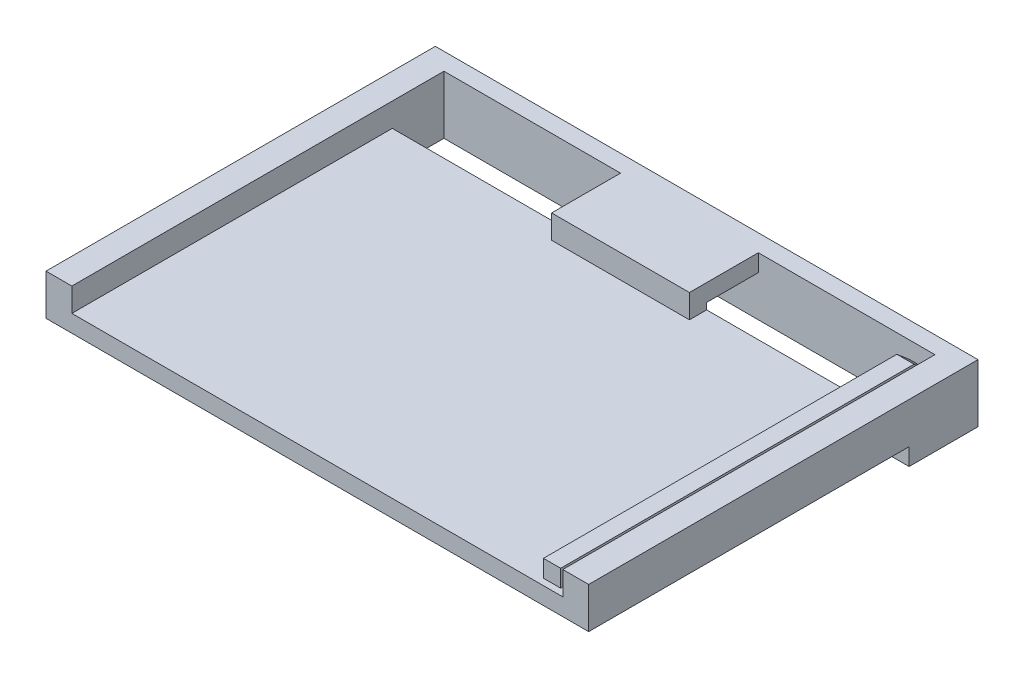
ISO-10303-21;
HEADER;
FILE_DESCRIPTION(('STEP AP214'),'2;1');
FILE_NAME('part.step','',(''),(''),'','','');
FILE_SCHEMA(('AUTOMOTIVE_DESIGN { 1 0 10303 214 1 1 1 1 }'));
ENDSEC;
DATA;
#1=APPLICATION_CONTEXT('core data for automotive mechanical design processes');
#2=APPLICATION_PROTOCOL_DEFINITION('international standard','automotive_design',2000,#1);
#3=PRODUCT_CONTEXT('',#1,'mechanical');
#4=PRODUCT('Part','Part','',(#3));
#5=PRODUCT_RELATED_PRODUCT_CATEGORY('part','',(#4));
#6=PRODUCT_DEFINITION_FORMATION('','',#4);
#7=PRODUCT_DEFINITION_CONTEXT('part definition',#1,'design');
#8=PRODUCT_DEFINITION('design','',#6,#7);
#9=PRODUCT_DEFINITION_SHAPE('','',#8);
#10=(LENGTH_UNIT() NAMED_UNIT(*) SI_UNIT(.MILLI.,.METRE.));
#11=(NAMED_UNIT(*) PLANE_ANGLE_UNIT() SI_UNIT($,.RADIAN.));
#12=(NAMED_UNIT(*) SI_UNIT($,.STERADIAN.) SOLID_ANGLE_UNIT());
#13=UNCERTAINTY_MEASURE_WITH_UNIT(LENGTH_MEASURE(1.E-05),#10,'distance_accuracy_value','');
#14=(GEOMETRIC_REPRESENTATION_CONTEXT(3) GLOBAL_UNCERTAINTY_ASSIGNED_CONTEXT((#13)) GLOBAL_UNIT_ASSIGNED_CONTEXT((#10,
#11,#12)) REPRESENTATION_CONTEXT('',''));
#15=CARTESIAN_POINT('',(0.,0.,0.));
#16=DIRECTION('',(0.,0.,1.));
#17=DIRECTION('',(1.,0.,0.));
#18=AXIS2_PLACEMENT_3D('',#15,#16,#17);
#19=CARTESIAN_POINT('',(31.5,2.,-14.6));
#20=DIRECTION('',(0.,0.,-1.));
#21=DIRECTION('',(-1.,0.,0.));
#22=AXIS2_PLACEMENT_3D('',#19,#20,#21);
#23=PLANE('',#22);
#24=DIRECTION('',(1.,0.,0.));
#25=VECTOR('',#24,1.);
#26=CARTESIAN_POINT('',(31.5,0.,-14.6));
#27=LINE('',#26,#25);
#28=CARTESIAN_POINT('',(-31.5,0.,-14.6));
#29=VERTEX_POINT('',#28);
#30=CARTESIAN_POINT('',(-28.5,0.,-14.6));
#31=VERTEX_POINT('',#30);
#32=EDGE_CURVE('E309',#29,#31,#27,.T.);
#33=ORIENTED_EDGE('',*,*,#32,.T.);
#34=DIRECTION('',(0.,-1.,0.));
#35=VECTOR('',#34,1.);
#36=CARTESIAN_POINT('',(-28.5,6.75,-14.6));
#37=LINE('',#36,#35);
#38=CARTESIAN_POINT('',(-28.5,2.,-14.6));
#39=VERTEX_POINT('',#38);
#40=EDGE_CURVE('E247',#39,#31,#37,.T.);
#41=ORIENTED_EDGE('',*,*,#40,.F.);
#42=DIRECTION('',(1.,0.,0.));
#43=VECTOR('',#42,1.);
#44=CARTESIAN_POINT('',(31.5,2.,-14.6));
#45=LINE('',#44,#43);
#46=CARTESIAN_POINT('',(-31.5,2.,-14.6));
#47=VERTEX_POINT('',#46);
#48=EDGE_CURVE('E314',#47,#39,#45,.T.);
#49=ORIENTED_EDGE('',*,*,#48,.F.);
#50=DIRECTION('',(0.,-1.,0.));
#51=VECTOR('',#50,1.);
#52=CARTESIAN_POINT('',(-31.5,2.,-14.6));
#53=LINE('',#52,#51);
#54=EDGE_CURVE('E316',#47,#29,#53,.T.);
#55=ORIENTED_EDGE('',*,*,#54,.T.);
#56=EDGE_LOOP('',(#33,#41,#49,#55));
#57=FACE_BOUND('',#56,.T.);
#58=ADVANCED_FACE('F47',(#57),#23,.F.);
#59=CARTESIAN_POINT('',(-31.5,6.75,22.6));
#60=DIRECTION('',(0.,0.,-1.));
#61=DIRECTION('',(-1.,0.,0.));
#62=AXIS2_PLACEMENT_3D('',#59,#60,#61);
#63=PLANE('',#62);
#64=DIRECTION('',(1.,0.,0.));
#65=VECTOR('',#64,1.);
#66=CARTESIAN_POINT('',(-31.5,6.75,22.6));
#67=LINE('',#66,#65);
#68=CARTESIAN_POINT('',(28.5,6.75,22.6));
#69=VERTEX_POINT('',#68);
#70=CARTESIAN_POINT('',(31.5,6.75,22.6));
#71=VERTEX_POINT('',#70);
#72=EDGE_CURVE('E327',#69,#71,#67,.T.);
#73=ORIENTED_EDGE('',*,*,#72,.F.);
#74=DIRECTION('',(0.,1.,0.));
#75=VECTOR('',#74,1.);
#76=CARTESIAN_POINT('',(28.5,-69.5209060345295,22.6));
#77=LINE('',#76,#75);
#78=CARTESIAN_POINT('',(28.5,3.99999999999998,22.6));
#79=VERTEX_POINT('',#78);
#80=EDGE_CURVE('E274',#79,#69,#77,.T.);
#81=ORIENTED_EDGE('',*,*,#80,.F.);
#82=DIRECTION('',(1.,0.,0.));
#83=VECTOR('',#82,1.);
#84=CARTESIAN_POINT('',(-28.5,4.,22.6));
#85=LINE('',#84,#83);
#86=CARTESIAN_POINT('',(-28.5,4.,22.6));
#87=VERTEX_POINT('',#86);
#88=EDGE_CURVE('E256',#87,#79,#85,.T.);
#89=ORIENTED_EDGE('',*,*,#88,.F.);
#90=DIRECTION('',(0.,1.,0.));
#91=VECTOR('',#90,1.);
#92=CARTESIAN_POINT('',(-28.5,-69.5209060345295,22.6));
#93=LINE('',#92,#91);
#94=CARTESIAN_POINT('',(-28.5,6.75,22.6));
#95=VERTEX_POINT('',#94);
#96=EDGE_CURVE('E277',#87,#95,#93,.T.);
#97=ORIENTED_EDGE('',*,*,#96,.T.);
#98=CARTESIAN_POINT('',(-31.5,6.75,22.6));
#99=VERTEX_POINT('',#98);
#100=EDGE_CURVE('E329',#99,#95,#67,.T.);
#101=ORIENTED_EDGE('',*,*,#100,.F.);
#102=DIRECTION('',(0.,-1.,0.));
#103=VECTOR('',#102,1.);
#104=CARTESIAN_POINT('',(-31.5,6.75,22.6));
#105=LINE('',#104,#103);
#106=CARTESIAN_POINT('',(-31.5,2.,22.6));
#107=VERTEX_POINT('',#106);
#108=EDGE_CURVE('E55',#99,#107,#105,.T.);
#109=ORIENTED_EDGE('',*,*,#108,.T.);
#110=DIRECTION('',(-1.,0.,0.));
#111=VECTOR('',#110,1.);
#112=CARTESIAN_POINT('',(31.5,2.,22.6));
#113=LINE('',#112,#111);
#114=CARTESIAN_POINT('',(31.5,2.,22.6));
#115=VERTEX_POINT('',#114);
#116=EDGE_CURVE('E308',#115,#107,#113,.T.);
#117=ORIENTED_EDGE('',*,*,#116,.F.);
#118=DIRECTION('',(0.,-1.,0.));
#119=VECTOR('',#118,1.);
#120=CARTESIAN_POINT('',(31.5,6.75,22.6));
#121=LINE('',#120,#119);
#122=EDGE_CURVE('E347',#71,#115,#121,.T.);
#123=ORIENTED_EDGE('',*,*,#122,.F.);
#124=EDGE_LOOP('',(#73,#81,#89,#97,#101,#109,#117,#123));
#125=FACE_BOUND('',#124,.T.);
#126=ADVANCED_FACE('F354',(#125),#63,.F.);
#127=CARTESIAN_POINT('',(-31.5,6.75,-22.6));
#128=DIRECTION('',(1.,0.,0.));
#129=DIRECTION('',(0.,0.,-1.));
#130=AXIS2_PLACEMENT_3D('',#127,#128,#129);
#131=PLANE('',#130);
#132=DIRECTION('',(0.,0.,1.));
#133=VECTOR('',#132,1.);
#134=CARTESIAN_POINT('',(-31.5,0.,-22.6));
#135=LINE('',#134,#133);
#136=CARTESIAN_POINT('',(-31.5,0.,-22.6));
#137=VERTEX_POINT('',#136);
#138=EDGE_CURVE('E322',#137,#29,#135,.T.);
#139=ORIENTED_EDGE('',*,*,#138,.T.);
#140=ORIENTED_EDGE('',*,*,#54,.F.);
#141=DIRECTION('',(0.,0.,-1.));
#142=VECTOR('',#141,1.);
#143=CARTESIAN_POINT('',(-31.5,2.,-14.6));
#144=LINE('',#143,#142);
#145=EDGE_CURVE('E311',#107,#47,#144,.T.);
#146=ORIENTED_EDGE('',*,*,#145,.F.);
#147=ORIENTED_EDGE('',*,*,#108,.F.);
#148=DIRECTION('',(0.,0.,1.));
#149=VECTOR('',#148,1.);
#150=CARTESIAN_POINT('',(-31.5,6.75,-22.6));
#151=LINE('',#150,#149);
#152=CARTESIAN_POINT('',(-31.5,6.75,-22.6));
#153=VERTEX_POINT('',#152);
#154=EDGE_CURVE('E324',#153,#99,#151,.T.);
#155=ORIENTED_EDGE('',*,*,#154,.F.);
#156=DIRECTION('',(0.,-1.,0.));
#157=VECTOR('',#156,1.);
#158=CARTESIAN_POINT('',(-31.5,6.75,-22.6));
#159=LINE('',#158,#157);
#160=EDGE_CURVE('E336',#153,#137,#159,.T.);
#161=ORIENTED_EDGE('',*,*,#160,.T.);
#162=EDGE_LOOP('',(#139,#140,#146,#147,#155,#161));
#163=FACE_BOUND('',#162,.T.);
#164=ADVANCED_FACE('F49',(#163),#131,.F.);
#165=CARTESIAN_POINT('',(31.5,6.75,-22.6));
#166=DIRECTION('',(-1.,0.,0.));
#167=DIRECTION('',(0.,0.,1.));
#168=AXIS2_PLACEMENT_3D('',#165,#166,#167);
#169=PLANE('',#168);
#170=DIRECTION('',(0.,0.,1.));
#171=VECTOR('',#170,1.);
#172=CARTESIAN_POINT('',(31.5,2.,-14.6));
#173=LINE('',#172,#171);
#174=CARTESIAN_POINT('',(31.5,2.,-14.6));
#175=VERTEX_POINT('',#174);
#176=EDGE_CURVE('E306',#175,#115,#173,.T.);
#177=ORIENTED_EDGE('',*,*,#176,.F.);
#178=DIRECTION('',(0.,-1.,0.));
#179=VECTOR('',#178,1.);
#180=CARTESIAN_POINT('',(31.5,2.,-14.6));
#181=LINE('',#180,#179);
#182=CARTESIAN_POINT('',(31.5,0.,-14.6));
#183=VERTEX_POINT('',#182);
#184=EDGE_CURVE('E319',#175,#183,#181,.T.);
#185=ORIENTED_EDGE('',*,*,#184,.T.);
#186=DIRECTION('',(0.,0.,-1.));
#187=VECTOR('',#186,1.);
#188=CARTESIAN_POINT('',(31.5,0.,-22.6));
#189=LINE('',#188,#187);
#190=CARTESIAN_POINT('',(31.5,0.,-22.6));
#191=VERTEX_POINT('',#190);
#192=EDGE_CURVE('E339',#183,#191,#189,.T.);
#193=ORIENTED_EDGE('',*,*,#192,.T.);
#194=DIRECTION('',(0.,-1.,0.));
#195=VECTOR('',#194,1.);
#196=CARTESIAN_POINT('',(31.5,6.75,-22.6));
#197=LINE('',#196,#195);
#198=CARTESIAN_POINT('',(31.5,6.75,-22.6));
#199=VERTEX_POINT('',#198);
#200=EDGE_CURVE('E344',#199,#191,#197,.T.);
#201=ORIENTED_EDGE('',*,*,#200,.F.);
#202=DIRECTION('',(0.,0.,-1.));
#203=VECTOR('',#202,1.);
#204=CARTESIAN_POINT('',(31.5,6.75,-22.6));
#205=LINE('',#204,#203);
#206=EDGE_CURVE('E332',#71,#199,#205,.T.);
#207=ORIENTED_EDGE('',*,*,#206,.F.);
#208=ORIENTED_EDGE('',*,*,#122,.T.);
#209=EDGE_LOOP('',(#177,#185,#193,#201,#207,#208));
#210=FACE_BOUND('',#209,.T.);
#211=ADVANCED_FACE('F432',(#210),#169,.F.);
#212=CARTESIAN_POINT('',(-31.5,6.75,-22.6));
#213=DIRECTION('',(0.,0.,1.));
#214=DIRECTION('',(1.,0.,0.));
#215=AXIS2_PLACEMENT_3D('',#212,#213,#214);
#216=PLANE('',#215);
#217=DIRECTION('',(-1.,0.,0.));
#218=VECTOR('',#217,1.);
#219=CARTESIAN_POINT('',(-31.5,0.,-22.6));
#220=LINE('',#219,#218);
#221=EDGE_CURVE('E328',#191,#137,#220,.T.);
#222=ORIENTED_EDGE('',*,*,#221,.T.);
#223=ORIENTED_EDGE('',*,*,#160,.F.);
#224=DIRECTION('',(-1.,0.,0.));
#225=VECTOR('',#224,1.);
#226=CARTESIAN_POINT('',(-31.5,6.75,-22.6));
#227=LINE('',#226,#225);
#228=EDGE_CURVE('E334',#199,#153,#227,.T.);
#229=ORIENTED_EDGE('',*,*,#228,.F.);
#230=ORIENTED_EDGE('',*,*,#200,.T.);
#231=EDGE_LOOP('',(#222,#223,#229,#230));
#232=FACE_BOUND('',#231,.T.);
#233=ADVANCED_FACE('F436',(#232),#216,.F.);
#234=CARTESIAN_POINT('',(0.,6.75,0.));
#235=DIRECTION('',(0.,1.,0.));
#236=DIRECTION('',(0.,0.,1.));
#237=AXIS2_PLACEMENT_3D('',#234,#235,#236);
#238=PLANE('',#237);
#239=DIRECTION('',(0.,0.,-1.));
#240=VECTOR('',#239,1.);
#241=CARTESIAN_POINT('',(28.5,6.75,-20.6));
#242=LINE('',#241,#240);
#243=CARTESIAN_POINT('',(28.5,6.75,-20.6));
#244=VERTEX_POINT('',#243);
#245=EDGE_CURVE('E268',#69,#244,#242,.T.);
#246=ORIENTED_EDGE('',*,*,#245,.F.);
#247=ORIENTED_EDGE('',*,*,#72,.T.);
#248=ORIENTED_EDGE('',*,*,#206,.T.);
#249=ORIENTED_EDGE('',*,*,#228,.T.);
#250=ORIENTED_EDGE('',*,*,#154,.T.);
#251=ORIENTED_EDGE('',*,*,#100,.T.);
#252=DIRECTION('',(0.,0.,1.));
#253=VECTOR('',#252,1.);
#254=CARTESIAN_POINT('',(-28.5,6.75,-20.6));
#255=LINE('',#254,#253);
#256=CARTESIAN_POINT('',(-28.5,6.75,-20.6));
#257=VERTEX_POINT('',#256);
#258=EDGE_CURVE('E253',#257,#95,#255,.T.);
#259=ORIENTED_EDGE('',*,*,#258,.F.);
#260=DIRECTION('',(-1.,0.,0.));
#261=VECTOR('',#260,1.);
#262=CARTESIAN_POINT('',(-28.5,6.75,-20.6));
#263=LINE('',#262,#261);
#264=CARTESIAN_POINT('',(-8.,6.75,-20.6));
#265=VERTEX_POINT('',#264);
#266=EDGE_CURVE('E254',#265,#257,#263,.T.);
#267=ORIENTED_EDGE('',*,*,#266,.F.);
#268=DIRECTION('',(0.,0.,-1.));
#269=VECTOR('',#268,1.);
#270=CARTESIAN_POINT('',(-8.,6.75,-20.6));
#271=LINE('',#270,#269);
#272=CARTESIAN_POINT('',(-8.,6.75,-12.6));
#273=VERTEX_POINT('',#272);
#274=EDGE_CURVE('E257',#273,#265,#271,.T.);
#275=ORIENTED_EDGE('',*,*,#274,.F.);
#276=DIRECTION('',(-1.,0.,0.));
#277=VECTOR('',#276,1.);
#278=CARTESIAN_POINT('',(-8.,6.75,-12.6));
#279=LINE('',#278,#277);
#280=CARTESIAN_POINT('',(8.,6.75,-12.6));
#281=VERTEX_POINT('',#280);
#282=EDGE_CURVE('E260',#281,#273,#279,.T.);
#283=ORIENTED_EDGE('',*,*,#282,.F.);
#284=DIRECTION('',(0.,0.,1.));
#285=VECTOR('',#284,1.);
#286=CARTESIAN_POINT('',(8.,6.75,-20.6));
#287=LINE('',#286,#285);
#288=CARTESIAN_POINT('',(8.,6.75,-20.6));
#289=VERTEX_POINT('',#288);
#290=EDGE_CURVE('E263',#289,#281,#287,.T.);
#291=ORIENTED_EDGE('',*,*,#290,.F.);
#292=DIRECTION('',(-1.,0.,0.));
#293=VECTOR('',#292,1.);
#294=CARTESIAN_POINT('',(8.,6.75,-20.6));
#295=LINE('',#294,#293);
#296=EDGE_CURVE('E265',#244,#289,#295,.T.);
#297=ORIENTED_EDGE('',*,*,#296,.F.);
#298=EDGE_LOOP('',(#246,#247,#248,#249,#250,#251,#259,#267,#275,#283,#291,#297));
#299=FACE_BOUND('',#298,.T.);
#300=ADVANCED_FACE('F440',(#299),#238,.T.);
#301=CARTESIAN_POINT('',(0.,0.,0.));
#302=DIRECTION('',(0.,1.,0.));
#303=DIRECTION('',(0.,0.,1.));
#304=AXIS2_PLACEMENT_3D('',#301,#302,#303);
#305=PLANE('',#304);
#306=DIRECTION('',(0.,0.,1.));
#307=VECTOR('',#306,1.);
#308=CARTESIAN_POINT('',(28.5,0.,-20.6));
#309=LINE('',#308,#307);
#310=CARTESIAN_POINT('',(28.5,0.,-17.8521260968111));
#311=VERTEX_POINT('',#310);
#312=CARTESIAN_POINT('',(28.5,0.,-14.6));
#313=VERTEX_POINT('',#312);
#314=EDGE_CURVE('E242',#311,#313,#309,.T.);
#315=ORIENTED_EDGE('',*,*,#314,.F.);
#316=DIRECTION('',(-1.,0.,0.));
#317=VECTOR('',#316,1.);
#318=CARTESIAN_POINT('',(29.5,0.,-17.8521260968111));
#319=LINE('',#318,#317);
#320=CARTESIAN_POINT('',(29.5,0.,-17.8521260968111));
#321=VERTEX_POINT('',#320);
#322=EDGE_CURVE('E401',#321,#311,#319,.T.);
#323=ORIENTED_EDGE('',*,*,#322,.F.);
#324=DIRECTION('',(0.,0.,1.));
#325=VECTOR('',#324,1.);
#326=CARTESIAN_POINT('',(29.5,0.,-20.6));
#327=LINE('',#326,#325);
#328=CARTESIAN_POINT('',(29.5,0.,-20.6));
#329=VERTEX_POINT('',#328);
#330=EDGE_CURVE('E477',#329,#321,#327,.T.);
#331=ORIENTED_EDGE('',*,*,#330,.F.);
#332=DIRECTION('',(-1.,0.,0.));
#333=VECTOR('',#332,1.);
#334=CARTESIAN_POINT('',(29.5,0.,-20.6));
#335=LINE('',#334,#333);
#336=CARTESIAN_POINT('',(28.5,0.,-20.6));
#337=VERTEX_POINT('',#336);
#338=EDGE_CURVE('E377',#329,#337,#335,.T.);
#339=ORIENTED_EDGE('',*,*,#338,.T.);
#340=DIRECTION('',(1.,0.,0.));
#341=VECTOR('',#340,1.);
#342=CARTESIAN_POINT('',(-28.5,0.,-20.6));
#343=LINE('',#342,#341);
#344=CARTESIAN_POINT('',(-28.5,0.,-20.6));
#345=VERTEX_POINT('',#344);
#346=EDGE_CURVE('E239',#345,#337,#343,.T.);
#347=ORIENTED_EDGE('',*,*,#346,.F.);
#348=DIRECTION('',(0.,0.,-1.));
#349=VECTOR('',#348,1.);
#350=CARTESIAN_POINT('',(-28.5,0.,-20.6));
#351=LINE('',#350,#349);
#352=EDGE_CURVE('E235',#31,#345,#351,.T.);
#353=ORIENTED_EDGE('',*,*,#352,.F.);
#354=ORIENTED_EDGE('',*,*,#32,.F.);
#355=ORIENTED_EDGE('',*,*,#138,.F.);
#356=ORIENTED_EDGE('',*,*,#221,.F.);
#357=ORIENTED_EDGE('',*,*,#192,.F.);
#358=EDGE_CURVE('E305',#313,#183,#27,.T.);
#359=ORIENTED_EDGE('',*,*,#358,.F.);
#360=EDGE_LOOP('',(#315,#323,#331,#339,#347,#353,#354,#355,#356,#357,#359));
#361=FACE_BOUND('',#360,.T.);
#362=ADVANCED_FACE('F373',(#361),#305,.F.);
#363=CARTESIAN_POINT('',(28.5,2.,-14.6));
#364=VERTEX_POINT('',#363);
#365=EDGE_CURVE('E313',#364,#175,#45,.T.);
#366=ORIENTED_EDGE('',*,*,#365,.F.);
#367=DIRECTION('',(0.,-1.,0.));
#368=VECTOR('',#367,1.);
#369=CARTESIAN_POINT('',(28.5,6.75,-14.6));
#370=LINE('',#369,#368);
#371=EDGE_CURVE('E236',#364,#313,#370,.T.);
#372=ORIENTED_EDGE('',*,*,#371,.T.);
#373=ORIENTED_EDGE('',*,*,#358,.T.);
#374=ORIENTED_EDGE('',*,*,#184,.F.);
#375=EDGE_LOOP('',(#366,#372,#373,#374));
#376=FACE_BOUND('',#375,.T.);
#377=ADVANCED_FACE('F425',(#376),#23,.F.);
#378=CARTESIAN_POINT('',(0.,2.,0.));
#379=DIRECTION('',(0.,-1.,0.));
#380=DIRECTION('',(0.,0.,-1.));
#381=AXIS2_PLACEMENT_3D('',#378,#379,#380);
#382=PLANE('',#381);
#383=DIRECTION('',(0.,0.,1.));
#384=VECTOR('',#383,1.);
#385=CARTESIAN_POINT('',(28.5,2.,0.));
#386=LINE('',#385,#384);
#387=CARTESIAN_POINT('',(28.5,2.,-12.6));
#388=VERTEX_POINT('',#387);
#389=EDGE_CURVE('E463',#364,#388,#386,.T.);
#390=ORIENTED_EDGE('',*,*,#389,.F.);
#391=ORIENTED_EDGE('',*,*,#365,.T.);
#392=ORIENTED_EDGE('',*,*,#176,.T.);
#393=ORIENTED_EDGE('',*,*,#116,.T.);
#394=ORIENTED_EDGE('',*,*,#145,.T.);
#395=ORIENTED_EDGE('',*,*,#48,.T.);
#396=CARTESIAN_POINT('',(24.5,2.,-14.6));
#397=VERTEX_POINT('',#396);
#398=EDGE_CURVE('E62',#39,#397,#45,.T.);
#399=ORIENTED_EDGE('',*,*,#398,.T.);
#400=DIRECTION('',(0.,0.,-1.));
#401=VECTOR('',#400,1.);
#402=CARTESIAN_POINT('',(24.5,2.,0.));
#403=LINE('',#402,#401);
#404=CARTESIAN_POINT('',(24.5,2.,-12.6));
#405=VERTEX_POINT('',#404);
#406=EDGE_CURVE('E220',#405,#397,#403,.T.);
#407=ORIENTED_EDGE('',*,*,#406,.F.);
#408=DIRECTION('',(-1.,0.,0.));
#409=VECTOR('',#408,1.);
#410=CARTESIAN_POINT('',(0.,2.,-12.6));
#411=LINE('',#410,#409);
#412=EDGE_CURVE('E394',#388,#405,#411,.T.);
#413=ORIENTED_EDGE('',*,*,#412,.F.);
#414=EDGE_LOOP('',(#390,#391,#392,#393,#394,#395,#399,#407,#413));
#415=FACE_BOUND('',#414,.T.);
#416=ADVANCED_FACE('F361',(#415),#382,.T.);
#417=CARTESIAN_POINT('',(0.,4.,0.));
#418=DIRECTION('',(0.,-1.,0.));
#419=DIRECTION('',(0.,0.,-1.));
#420=AXIS2_PLACEMENT_3D('',#417,#418,#419);
#421=PLANE('',#420);
#422=DIRECTION('',(0.,0.,-1.));
#423=VECTOR('',#422,1.);
#424=CARTESIAN_POINT('',(28.5,4.,-20.6));
#425=LINE('',#424,#423);
#426=CARTESIAN_POINT('',(28.5,4.,-12.6));
#427=VERTEX_POINT('',#426);
#428=EDGE_CURVE('E291',#79,#427,#425,.T.);
#429=ORIENTED_EDGE('',*,*,#428,.T.);
#430=DIRECTION('',(1.,0.,0.));
#431=VECTOR('',#430,1.);
#432=CARTESIAN_POINT('',(24.5,4.,-12.6));
#433=LINE('',#432,#431);
#434=CARTESIAN_POINT('',(24.5,4.,-12.6));
#435=VERTEX_POINT('',#434);
#436=EDGE_CURVE('E229',#435,#427,#433,.T.);
#437=ORIENTED_EDGE('',*,*,#436,.F.);
#438=DIRECTION('',(0.,0.,1.));
#439=VECTOR('',#438,1.);
#440=CARTESIAN_POINT('',(24.5,4.,-12.6));
#441=LINE('',#440,#439);
#442=CARTESIAN_POINT('',(24.5,4.,-14.6));
#443=VERTEX_POINT('',#442);
#444=EDGE_CURVE('E218',#443,#435,#441,.T.);
#445=ORIENTED_EDGE('',*,*,#444,.F.);
#446=DIRECTION('',(-1.,0.,0.));
#447=VECTOR('',#446,1.);
#448=CARTESIAN_POINT('',(0.,4.,-14.6));
#449=LINE('',#448,#447);
#450=CARTESIAN_POINT('',(8.,3.99999999999998,-14.6));
#451=VERTEX_POINT('',#450);
#452=EDGE_CURVE('E226',#443,#451,#449,.T.);
#453=ORIENTED_EDGE('',*,*,#452,.T.);
#454=DIRECTION('',(0.,0.,1.));
#455=VECTOR('',#454,1.);
#456=CARTESIAN_POINT('',(8.,4.,-20.6));
#457=LINE('',#456,#455);
#458=CARTESIAN_POINT('',(8.,4.,-12.6));
#459=VERTEX_POINT('',#458);
#460=EDGE_CURVE('E288',#451,#459,#457,.T.);
#461=ORIENTED_EDGE('',*,*,#460,.T.);
#462=DIRECTION('',(-1.,0.,0.));
#463=VECTOR('',#462,1.);
#464=CARTESIAN_POINT('',(-8.,4.,-12.6));
#465=LINE('',#464,#463);
#466=CARTESIAN_POINT('',(-8.,4.,-12.6));
#467=VERTEX_POINT('',#466);
#468=EDGE_CURVE('E284',#459,#467,#465,.T.);
#469=ORIENTED_EDGE('',*,*,#468,.T.);
#470=DIRECTION('',(0.,0.,-1.));
#471=VECTOR('',#470,1.);
#472=CARTESIAN_POINT('',(-8.,4.,-20.6));
#473=LINE('',#472,#471);
#474=CARTESIAN_POINT('',(-8.,3.99999999999998,-14.6));
#475=VERTEX_POINT('',#474);
#476=EDGE_CURVE('E279',#467,#475,#473,.T.);
#477=ORIENTED_EDGE('',*,*,#476,.T.);
#478=DIRECTION('',(-1.,0.,0.));
#479=VECTOR('',#478,1.);
#480=CARTESIAN_POINT('',(0.,4.,-14.6));
#481=LINE('',#480,#479);
#482=CARTESIAN_POINT('',(-28.5,3.99999999999998,-14.6));
#483=VERTEX_POINT('',#482);
#484=EDGE_CURVE('E250',#475,#483,#481,.T.);
#485=ORIENTED_EDGE('',*,*,#484,.T.);
#486=DIRECTION('',(0.,0.,1.));
#487=VECTOR('',#486,1.);
#488=CARTESIAN_POINT('',(-28.5,4.,-20.6));
#489=LINE('',#488,#487);
#490=EDGE_CURVE('E275',#483,#87,#489,.T.);
#491=ORIENTED_EDGE('',*,*,#490,.T.);
#492=ORIENTED_EDGE('',*,*,#88,.T.);
#493=EDGE_LOOP('',(#429,#437,#445,#453,#461,#469,#477,#485,#491,#492));
#494=FACE_BOUND('',#493,.T.);
#495=ADVANCED_FACE('F225',(#494),#421,.F.);
#496=CARTESIAN_POINT('',(28.5,-69.5209060345295,-20.6));
#497=DIRECTION('',(1.,0.,0.));
#498=DIRECTION('',(0.,0.,-1.));
#499=AXIS2_PLACEMENT_3D('',#496,#497,#498);
#500=PLANE('',#499);
#501=ORIENTED_EDGE('',*,*,#245,.T.);
#502=DIRECTION('',(0.,1.,0.));
#503=VECTOR('',#502,1.);
#504=CARTESIAN_POINT('',(28.5,-69.5209060345295,-20.6));
#505=LINE('',#504,#503);
#506=EDGE_CURVE('E293',#337,#244,#505,.T.);
#507=ORIENTED_EDGE('',*,*,#506,.F.);
#508=DIRECTION('',(0.,-0.998629534754574,-0.0523359562429434));
#509=VECTOR('',#508,1.);
#510=CARTESIAN_POINT('',(28.5,4.75,-20.3510630484056));
#511=LINE('',#510,#509);
#512=CARTESIAN_POINT('',(28.5,4.75,-20.3510630484056));
#513=VERTEX_POINT('',#512);
#514=EDGE_CURVE('E384',#513,#337,#511,.T.);
#515=ORIENTED_EDGE('',*,*,#514,.F.);
#516=CARTESIAN_POINT('',(28.5,4.75,-19.2260630484056));
#517=DIRECTION('',(-1.,0.,0.));
#518=DIRECTION('',(0.,0.,1.));
#519=AXIS2_PLACEMENT_3D('',#516,#517,#518);
#520=CIRCLE('',#519,1.125);
#521=CARTESIAN_POINT('',(28.5,4.75,-18.1010630484056));
#522=VERTEX_POINT('',#521);
#523=EDGE_CURVE('E70',#522,#513,#520,.T.);
#524=ORIENTED_EDGE('',*,*,#523,.F.);
#525=DIRECTION('',(0.,0.998629534754574,-0.0523359562429434));
#526=VECTOR('',#525,1.);
#527=CARTESIAN_POINT('',(28.5,4.75,-18.1010630484056));
#528=LINE('',#527,#526);
#529=EDGE_CURVE('E390',#311,#522,#528,.T.);
#530=ORIENTED_EDGE('',*,*,#529,.F.);
#531=ORIENTED_EDGE('',*,*,#314,.T.);
#532=ORIENTED_EDGE('',*,*,#371,.F.);
#533=ORIENTED_EDGE('',*,*,#389,.T.);
#534=DIRECTION('',(0.,1.,0.));
#535=VECTOR('',#534,1.);
#536=CARTESIAN_POINT('',(28.5,0.,-12.6));
#537=LINE('',#536,#535);
#538=EDGE_CURVE('E465',#388,#427,#537,.T.);
#539=ORIENTED_EDGE('',*,*,#538,.T.);
#540=ORIENTED_EDGE('',*,*,#428,.F.);
#541=ORIENTED_EDGE('',*,*,#80,.T.);
#542=EDGE_LOOP('',(#501,#507,#515,#524,#530,#531,#532,#533,#539,#540,#541));
#543=FACE_BOUND('',#542,.T.);
#544=ADVANCED_FACE('F420',(#543),#500,.F.);
#545=CARTESIAN_POINT('',(8.,-69.5209060345295,-20.6));
#546=DIRECTION('',(0.,0.,-1.));
#547=DIRECTION('',(-1.,0.,0.));
#548=AXIS2_PLACEMENT_3D('',#545,#546,#547);
#549=PLANE('',#548);
#550=ORIENTED_EDGE('',*,*,#346,.T.);
#551=ORIENTED_EDGE('',*,*,#506,.T.);
#552=ORIENTED_EDGE('',*,*,#296,.T.);
#553=DIRECTION('',(0.,1.,0.));
#554=VECTOR('',#553,1.);
#555=CARTESIAN_POINT('',(8.,-69.5209060345295,-20.6));
#556=LINE('',#555,#554);
#557=CARTESIAN_POINT('',(8.,4.75,-20.6));
#558=VERTEX_POINT('',#557);
#559=EDGE_CURVE('E290',#558,#289,#556,.T.);
#560=ORIENTED_EDGE('',*,*,#559,.F.);
#561=DIRECTION('',(1.,0.,0.));
#562=VECTOR('',#561,1.);
#563=CARTESIAN_POINT('',(8.,4.75,-20.6));
#564=LINE('',#563,#562);
#565=CARTESIAN_POINT('',(-8.,4.75,-20.6));
#566=VERTEX_POINT('',#565);
#567=EDGE_CURVE('E412',#566,#558,#564,.T.);
#568=ORIENTED_EDGE('',*,*,#567,.F.);
#569=DIRECTION('',(0.,1.,0.));
#570=VECTOR('',#569,1.);
#571=CARTESIAN_POINT('',(-8.,-69.5209060345295,-20.6));
#572=LINE('',#571,#570);
#573=EDGE_CURVE('E282',#566,#265,#572,.T.);
#574=ORIENTED_EDGE('',*,*,#573,.T.);
#575=ORIENTED_EDGE('',*,*,#266,.T.);
#576=DIRECTION('',(0.,1.,0.));
#577=VECTOR('',#576,1.);
#578=CARTESIAN_POINT('',(-28.5,-69.5209060345295,-20.6));
#579=LINE('',#578,#577);
#580=EDGE_CURVE('E278',#345,#257,#579,.T.);
#581=ORIENTED_EDGE('',*,*,#580,.F.);
#582=EDGE_LOOP('',(#550,#551,#552,#560,#568,#574,#575,#581));
#583=FACE_BOUND('',#582,.T.);
#584=ADVANCED_FACE('F381',(#583),#549,.F.);
#585=CARTESIAN_POINT('',(8.,-69.5209060345295,-20.6));
#586=DIRECTION('',(-1.,0.,0.));
#587=DIRECTION('',(0.,0.,1.));
#588=AXIS2_PLACEMENT_3D('',#585,#586,#587);
#589=PLANE('',#588);
#590=DIRECTION('',(0.,-1.,0.));
#591=VECTOR('',#590,1.);
#592=CARTESIAN_POINT('',(8.,23.8380074906351,-14.6));
#593=LINE('',#592,#591);
#594=CARTESIAN_POINT('',(8.,4.75,-14.6));
#595=VERTEX_POINT('',#594);
#596=EDGE_CURVE('E233',#595,#451,#593,.T.);
#597=ORIENTED_EDGE('',*,*,#596,.F.);
#598=DIRECTION('',(0.,0.,1.));
#599=VECTOR('',#598,1.);
#600=CARTESIAN_POINT('',(8.,4.75,-20.6));
#601=LINE('',#600,#599);
#602=EDGE_CURVE('E409',#558,#595,#601,.T.);
#603=ORIENTED_EDGE('',*,*,#602,.F.);
#604=ORIENTED_EDGE('',*,*,#559,.T.);
#605=ORIENTED_EDGE('',*,*,#290,.T.);
#606=DIRECTION('',(0.,1.,0.));
#607=VECTOR('',#606,1.);
#608=CARTESIAN_POINT('',(8.,-69.5209060345295,-12.6));
#609=LINE('',#608,#607);
#610=EDGE_CURVE('E287',#459,#281,#609,.T.);
#611=ORIENTED_EDGE('',*,*,#610,.F.);
#612=ORIENTED_EDGE('',*,*,#460,.F.);
#613=EDGE_LOOP('',(#597,#603,#604,#605,#611,#612));
#614=FACE_BOUND('',#613,.T.);
#615=ADVANCED_FACE('F449',(#614),#589,.F.);
#616=CARTESIAN_POINT('',(-8.,-69.5209060345295,-12.6));
#617=DIRECTION('',(0.,0.,-1.));
#618=DIRECTION('',(-1.,0.,0.));
#619=AXIS2_PLACEMENT_3D('',#616,#617,#618);
#620=PLANE('',#619);
#621=ORIENTED_EDGE('',*,*,#610,.T.);
#622=ORIENTED_EDGE('',*,*,#282,.T.);
#623=DIRECTION('',(0.,1.,0.));
#624=VECTOR('',#623,1.);
#625=CARTESIAN_POINT('',(-8.,-69.5209060345295,-12.6));
#626=LINE('',#625,#624);
#627=EDGE_CURVE('E283',#467,#273,#626,.T.);
#628=ORIENTED_EDGE('',*,*,#627,.F.);
#629=ORIENTED_EDGE('',*,*,#468,.F.);
#630=EDGE_LOOP('',(#621,#622,#628,#629));
#631=FACE_BOUND('',#630,.T.);
#632=ADVANCED_FACE('F668',(#631),#620,.F.);
#633=CARTESIAN_POINT('',(-8.,-69.5209060345295,-20.6));
#634=DIRECTION('',(1.,0.,0.));
#635=DIRECTION('',(0.,0.,-1.));
#636=AXIS2_PLACEMENT_3D('',#633,#634,#635);
#637=PLANE('',#636);
#638=ORIENTED_EDGE('',*,*,#573,.F.);
#639=DIRECTION('',(0.,0.,-1.));
#640=VECTOR('',#639,1.);
#641=CARTESIAN_POINT('',(-8.,4.75,-20.6));
#642=LINE('',#641,#640);
#643=CARTESIAN_POINT('',(-8.,4.75000000000001,-14.6));
#644=VERTEX_POINT('',#643);
#645=EDGE_CURVE('E414',#644,#566,#642,.T.);
#646=ORIENTED_EDGE('',*,*,#645,.F.);
#647=DIRECTION('',(0.,-1.,0.));
#648=VECTOR('',#647,1.);
#649=CARTESIAN_POINT('',(-8.,23.8380074906351,-14.6));
#650=LINE('',#649,#648);
#651=EDGE_CURVE('E408',#644,#475,#650,.T.);
#652=ORIENTED_EDGE('',*,*,#651,.T.);
#653=ORIENTED_EDGE('',*,*,#476,.F.);
#654=ORIENTED_EDGE('',*,*,#627,.T.);
#655=ORIENTED_EDGE('',*,*,#274,.T.);
#656=EDGE_LOOP('',(#638,#646,#652,#653,#654,#655));
#657=FACE_BOUND('',#656,.T.);
#658=ADVANCED_FACE('F456',(#657),#637,.F.);
#659=CARTESIAN_POINT('',(-28.5,-69.5209060345295,-20.6));
#660=DIRECTION('',(-1.,0.,0.));
#661=DIRECTION('',(0.,0.,1.));
#662=AXIS2_PLACEMENT_3D('',#659,#660,#661);
#663=PLANE('',#662);
#664=ORIENTED_EDGE('',*,*,#490,.F.);
#665=EDGE_CURVE('E249',#483,#39,#37,.T.);
#666=ORIENTED_EDGE('',*,*,#665,.T.);
#667=ORIENTED_EDGE('',*,*,#40,.T.);
#668=ORIENTED_EDGE('',*,*,#352,.T.);
#669=ORIENTED_EDGE('',*,*,#580,.T.);
#670=ORIENTED_EDGE('',*,*,#258,.T.);
#671=ORIENTED_EDGE('',*,*,#96,.F.);
#672=EDGE_LOOP('',(#664,#666,#667,#668,#669,#670,#671));
#673=FACE_BOUND('',#672,.T.);
#674=ADVANCED_FACE('F369',(#673),#663,.F.);
#675=CARTESIAN_POINT('',(-28.5,6.75,-14.6));
#676=DIRECTION('',(0.,0.,1.));
#677=DIRECTION('',(1.,0.,0.));
#678=AXIS2_PLACEMENT_3D('',#675,#676,#677);
#679=PLANE('',#678);
#680=ORIENTED_EDGE('',*,*,#596,.T.);
#681=ORIENTED_EDGE('',*,*,#452,.F.);
#682=DIRECTION('',(0.,-1.,0.));
#683=VECTOR('',#682,1.);
#684=CARTESIAN_POINT('',(24.5,6.75,-14.6));
#685=LINE('',#684,#683);
#686=EDGE_CURVE('E13',#443,#397,#685,.T.);
#687=ORIENTED_EDGE('',*,*,#686,.T.);
#688=ORIENTED_EDGE('',*,*,#398,.F.);
#689=ORIENTED_EDGE('',*,*,#665,.F.);
#690=ORIENTED_EDGE('',*,*,#484,.F.);
#691=ORIENTED_EDGE('',*,*,#651,.F.);
#692=DIRECTION('',(-1.,0.,0.));
#693=VECTOR('',#692,1.);
#694=CARTESIAN_POINT('',(8.,4.75,-14.6));
#695=LINE('',#694,#693);
#696=EDGE_CURVE('E400',#595,#644,#695,.T.);
#697=ORIENTED_EDGE('',*,*,#696,.F.);
#698=EDGE_LOOP('',(#680,#681,#687,#688,#689,#690,#691,#697));
#699=FACE_BOUND('',#698,.T.);
#700=ADVANCED_FACE('F231',(#699),#679,.F.);
#701=CARTESIAN_POINT('',(0.,4.75,0.));
#702=DIRECTION('',(0.,1.,0.));
#703=DIRECTION('',(0.,0.,1.));
#704=AXIS2_PLACEMENT_3D('',#701,#702,#703);
#705=PLANE('',#704);
#706=ORIENTED_EDGE('',*,*,#602,.T.);
#707=ORIENTED_EDGE('',*,*,#696,.T.);
#708=ORIENTED_EDGE('',*,*,#645,.T.);
#709=ORIENTED_EDGE('',*,*,#567,.T.);
#710=EDGE_LOOP('',(#706,#707,#708,#709));
#711=FACE_BOUND('',#710,.T.);
#712=ADVANCED_FACE('F452',(#711),#705,.F.);
#713=CARTESIAN_POINT('',(29.5,4.75,-19.2260630484056));
#714=DIRECTION('',(-1.,0.,0.));
#715=DIRECTION('',(0.,0.,1.));
#716=AXIS2_PLACEMENT_3D('',#713,#714,#715);
#717=CYLINDRICAL_SURFACE('',#716,1.125);
#718=ORIENTED_EDGE('',*,*,#523,.T.);
#719=DIRECTION('',(-1.,0.,0.));
#720=VECTOR('',#719,1.);
#721=CARTESIAN_POINT('',(29.5,4.75,-20.3510630484056));
#722=LINE('',#721,#720);
#723=CARTESIAN_POINT('',(29.5,4.75,-20.3510630484056));
#724=VERTEX_POINT('',#723);
#725=EDGE_CURVE('E388',#724,#513,#722,.T.);
#726=ORIENTED_EDGE('',*,*,#725,.F.);
#727=CARTESIAN_POINT('',(29.5,4.75,-19.2260630484056));
#728=DIRECTION('',(-1.,0.,0.));
#729=DIRECTION('',(0.,0.,1.));
#730=AXIS2_PLACEMENT_3D('',#727,#728,#729);
#731=CIRCLE('',#730,1.125);
#732=CARTESIAN_POINT('',(29.5,4.75,-18.1010630484056));
#733=VERTEX_POINT('',#732);
#734=EDGE_CURVE('E392',#733,#724,#731,.T.);
#735=ORIENTED_EDGE('',*,*,#734,.F.);
#736=DIRECTION('',(-1.,0.,0.));
#737=VECTOR('',#736,1.);
#738=CARTESIAN_POINT('',(29.5,4.75,-18.1010630484056));
#739=LINE('',#738,#737);
#740=EDGE_CURVE('E398',#733,#522,#739,.T.);
#741=ORIENTED_EDGE('',*,*,#740,.T.);
#742=EDGE_LOOP('',(#718,#726,#735,#741));
#743=FACE_BOUND('',#742,.T.);
#744=ADVANCED_FACE('F485',(#743),#717,.F.);
#745=CARTESIAN_POINT('',(29.5,4.75,-18.1010630484056));
#746=DIRECTION('',(0.,0.0523359562429434,0.998629534754574));
#747=DIRECTION('',(0.,-0.998629534754574,0.0523359562429434));
#748=AXIS2_PLACEMENT_3D('',#745,#746,#747);
#749=PLANE('',#748);
#750=ORIENTED_EDGE('',*,*,#529,.T.);
#751=ORIENTED_EDGE('',*,*,#740,.F.);
#752=DIRECTION('',(0.,0.998629534754574,-0.0523359562429434));
#753=VECTOR('',#752,1.);
#754=CARTESIAN_POINT('',(29.5,4.75,-18.1010630484056));
#755=LINE('',#754,#753);
#756=EDGE_CURVE('E405',#321,#733,#755,.T.);
#757=ORIENTED_EDGE('',*,*,#756,.F.);
#758=ORIENTED_EDGE('',*,*,#322,.T.);
#759=EDGE_LOOP('',(#750,#751,#757,#758));
#760=FACE_BOUND('',#759,.T.);
#761=ADVANCED_FACE('F484',(#760),#749,.F.);
#762=CARTESIAN_POINT('',(29.5,4.75,-20.3510630484056));
#763=DIRECTION('',(0.,0.0523359562429434,-0.998629534754574));
#764=DIRECTION('',(0.,0.998629534754574,0.0523359562429434));
#765=AXIS2_PLACEMENT_3D('',#762,#763,#764);
#766=PLANE('',#765);
#767=ORIENTED_EDGE('',*,*,#514,.T.);
#768=ORIENTED_EDGE('',*,*,#338,.F.);
#769=DIRECTION('',(0.,-0.998629534754574,-0.0523359562429434));
#770=VECTOR('',#769,1.);
#771=CARTESIAN_POINT('',(29.5,4.75,-20.3510630484056));
#772=LINE('',#771,#770);
#773=EDGE_CURVE('E475',#724,#329,#772,.T.);
#774=ORIENTED_EDGE('',*,*,#773,.F.);
#775=ORIENTED_EDGE('',*,*,#725,.T.);
#776=EDGE_LOOP('',(#767,#768,#774,#775));
#777=FACE_BOUND('',#776,.T.);
#778=ADVANCED_FACE('F385',(#777),#766,.F.);
#779=CARTESIAN_POINT('',(29.5,4.75,-19.2260630484056));
#780=DIRECTION('',(-1.,0.,0.));
#781=DIRECTION('',(0.,0.,1.));
#782=AXIS2_PLACEMENT_3D('',#779,#780,#781);
#783=PLANE('',#782);
#784=ORIENTED_EDGE('',*,*,#734,.T.);
#785=ORIENTED_EDGE('',*,*,#773,.T.);
#786=ORIENTED_EDGE('',*,*,#330,.T.);
#787=ORIENTED_EDGE('',*,*,#756,.T.);
#788=EDGE_LOOP('',(#784,#785,#786,#787));
#789=FACE_BOUND('',#788,.T.);
#790=ADVANCED_FACE('F481',(#789),#783,.T.);
#791=CARTESIAN_POINT('',(24.5,0.,-12.6));
#792=DIRECTION('',(0.,0.,1.));
#793=DIRECTION('',(1.,0.,0.));
#794=AXIS2_PLACEMENT_3D('',#791,#792,#793);
#795=PLANE('',#794);
#796=ORIENTED_EDGE('',*,*,#412,.T.);
#797=DIRECTION('',(0.,1.,0.));
#798=VECTOR('',#797,1.);
#799=CARTESIAN_POINT('',(24.5,0.,-12.6));
#800=LINE('',#799,#798);
#801=EDGE_CURVE('E468',#405,#435,#800,.T.);
#802=ORIENTED_EDGE('',*,*,#801,.T.);
#803=ORIENTED_EDGE('',*,*,#436,.T.);
#804=ORIENTED_EDGE('',*,*,#538,.F.);
#805=EDGE_LOOP('',(#796,#802,#803,#804));
#806=FACE_BOUND('',#805,.T.);
#807=ADVANCED_FACE('F587',(#806),#795,.F.);
#808=CARTESIAN_POINT('',(24.5,0.,-12.6));
#809=DIRECTION('',(-1.,0.,0.));
#810=DIRECTION('',(0.,0.,1.));
#811=AXIS2_PLACEMENT_3D('',#808,#809,#810);
#812=PLANE('',#811);
#813=ORIENTED_EDGE('',*,*,#406,.T.);
#814=ORIENTED_EDGE('',*,*,#686,.F.);
#815=ORIENTED_EDGE('',*,*,#444,.T.);
#816=ORIENTED_EDGE('',*,*,#801,.F.);
#817=EDGE_LOOP('',(#813,#814,#815,#816));
#818=FACE_BOUND('',#817,.T.);
#819=ADVANCED_FACE('F216',(#818),#812,.F.);
#820=CLOSED_SHELL('',(#58,#126,#164,#211,#233,#300,#362,#377,#416,#495,#544,#584,#615,#632,#658,
#674,#700,#712,#744,#761,#778,#790,#807,#819));
#821=MANIFOLD_SOLID_BREP('B2',#820);
#822=CARTESIAN_POINT('',(28.25,4.75,-19.2260630484056));
#823=DIRECTION('',(1.,0.,0.));
#824=DIRECTION('',(0.,0.,-1.));
#825=AXIS2_PLACEMENT_3D('',#822,#823,#824);
#826=CYLINDRICAL_SURFACE('',#825,1.);
#827=CARTESIAN_POINT('',(28.25,4.75,-19.2260630484056));
#828=DIRECTION('',(-1.,0.,0.));
#829=DIRECTION('',(0.,0.,1.));
#830=AXIS2_PLACEMENT_3D('',#827,#828,#829);
#831=CIRCLE('',#830,1.);
#832=CARTESIAN_POINT('',(28.25,3.99061776455932,-18.5754182755094));
#833=VERTEX_POINT('',#832);
#834=CARTESIAN_POINT('',(28.25,5.50938223544068,-19.8767078213017));
#835=VERTEX_POINT('',#834);
#836=EDGE_CURVE('E45',#833,#835,#831,.T.);
#837=ORIENTED_EDGE('',*,*,#836,.F.);
#838=DIRECTION('',(1.,0.,0.));
#839=VECTOR('',#838,1.);
#840=CARTESIAN_POINT('',(26.25,3.99061776455932,-18.5754182755094));
#841=LINE('',#840,#839);
#842=CARTESIAN_POINT('',(26.25,3.99061776455932,-18.5754182755094));
#843=VERTEX_POINT('',#842);
#844=EDGE_CURVE('E818',#843,#833,#841,.T.);
#845=ORIENTED_EDGE('',*,*,#844,.F.);
#846=CARTESIAN_POINT('',(26.25,4.75,-19.2260630484056));
#847=DIRECTION('',(-1.,0.,0.));
#848=DIRECTION('',(0.,0.,1.));
#849=AXIS2_PLACEMENT_3D('',#846,#847,#848);
#850=CIRCLE('',#849,1.);
#851=CARTESIAN_POINT('',(26.25,5.50938223544068,-19.8767078213017));
#852=VERTEX_POINT('',#851);
#853=EDGE_CURVE('E824',#852,#843,#850,.T.);
#854=ORIENTED_EDGE('',*,*,#853,.F.);
#855=DIRECTION('',(1.,0.,0.));
#856=VECTOR('',#855,1.);
#857=CARTESIAN_POINT('',(26.25,5.50938223544068,-19.8767078213017));
#858=LINE('',#857,#856);
#859=EDGE_CURVE('E802',#852,#835,#858,.T.);
#860=ORIENTED_EDGE('',*,*,#859,.T.);
#861=EDGE_LOOP('',(#837,#845,#854,#860));
#862=FACE_BOUND('',#861,.T.);
#863=CARTESIAN_POINT('',(29.,4.75,-19.2260630484056));
#864=DIRECTION('',(-1.,0.,0.));
#865=DIRECTION('',(0.,0.,1.));
#866=AXIS2_PLACEMENT_3D('',#863,#864,#865);
#867=CIRCLE('',#866,1.);
#868=CARTESIAN_POINT('',(29.,4.75,-18.2260630484056));
#869=VERTEX_POINT('',#868);
#870=EDGE_CURVE('E726',#869,#869,#867,.T.);
#871=ORIENTED_EDGE('',*,*,#870,.T.);
#872=EDGE_LOOP('',(#871));
#873=FACE_BOUND('',#872,.T.);
#874=ADVANCED_FACE('F718',(#862,#873),#826,.T.);
#875=CARTESIAN_POINT('',(29.,4.75,-19.2260630484056));
#876=DIRECTION('',(-1.,0.,0.));
#877=DIRECTION('',(0.,0.,1.));
#878=AXIS2_PLACEMENT_3D('',#875,#876,#877);
#879=PLANE('',#878);
#880=ORIENTED_EDGE('',*,*,#870,.F.);
#881=EDGE_LOOP('',(#880));
#882=FACE_BOUND('',#881,.T.);
#883=ADVANCED_FACE('F853',(#882),#879,.F.);
#884=CARTESIAN_POINT('',(28.25,4.75,-19.2260630484056));
#885=DIRECTION('',(-1.,0.,0.));
#886=DIRECTION('',(0.,0.,1.));
#887=AXIS2_PLACEMENT_3D('',#884,#885,#886);
#888=PLANE('',#887);
#889=DIRECTION('',(0.,0.650644772896171,0.759382235440684));
#890=VECTOR('',#889,1.);
#891=CARTESIAN_POINT('',(28.25,3.99061776455932,-18.5754182755094));
#892=LINE('',#891,#890);
#893=CARTESIAN_POINT('',(28.25,4.75,-17.6891260873219));
#894=VERTEX_POINT('',#893);
#895=EDGE_CURVE('E808',#833,#894,#892,.T.);
#896=ORIENTED_EDGE('',*,*,#895,.F.);
#897=ORIENTED_EDGE('',*,*,#836,.T.);
#898=DIRECTION('',(0.,-0.650644772896172,-0.759382235440683));
#899=VECTOR('',#898,1.);
#900=CARTESIAN_POINT('',(28.25,5.50938223544068,-19.8767078213017));
#901=LINE('',#900,#899);
#902=CARTESIAN_POINT('',(28.25,6.75,-18.428754759011));
#903=VERTEX_POINT('',#902);
#904=EDGE_CURVE('E812',#903,#835,#901,.T.);
#905=ORIENTED_EDGE('',*,*,#904,.F.);
#906=DIRECTION('',(0.,0.,-1.));
#907=VECTOR('',#906,1.);
#908=CARTESIAN_POINT('',(28.25,6.75,22.6));
#909=LINE('',#908,#907);
#910=CARTESIAN_POINT('',(28.25,6.75,22.6));
#911=VERTEX_POINT('',#910);
#912=EDGE_CURVE('E810',#911,#903,#909,.T.);
#913=ORIENTED_EDGE('',*,*,#912,.F.);
#914=DIRECTION('',(0.,1.,0.));
#915=VECTOR('',#914,1.);
#916=CARTESIAN_POINT('',(28.25,4.75,22.6));
#917=LINE('',#916,#915);
#918=CARTESIAN_POINT('',(28.25,4.75,22.6));
#919=VERTEX_POINT('',#918);
#920=EDGE_CURVE('E793',#919,#911,#917,.T.);
#921=ORIENTED_EDGE('',*,*,#920,.F.);
#922=DIRECTION('',(0.,0.,1.));
#923=VECTOR('',#922,1.);
#924=CARTESIAN_POINT('',(28.25,4.75,-17.6891260873219));
#925=LINE('',#924,#923);
#926=EDGE_CURVE('E806',#894,#919,#925,.T.);
#927=ORIENTED_EDGE('',*,*,#926,.F.);
#928=EDGE_LOOP('',(#896,#897,#905,#913,#921,#927));
#929=FACE_BOUND('',#928,.T.);
#930=ADVANCED_FACE('F840',(#929),#888,.F.);
#931=CARTESIAN_POINT('',(26.25,3.99061776455932,-18.5754182755094));
#932=DIRECTION('',(0.,0.759382235440684,-0.650644772896171));
#933=DIRECTION('',(0.,0.650644772896171,0.759382235440684));
#934=AXIS2_PLACEMENT_3D('',#931,#932,#933);
#935=PLANE('',#934);
#936=ORIENTED_EDGE('',*,*,#895,.T.);
#937=DIRECTION('',(1.,0.,0.));
#938=VECTOR('',#937,1.);
#939=CARTESIAN_POINT('',(26.25,4.75,-17.6891260873219));
#940=LINE('',#939,#938);
#941=CARTESIAN_POINT('',(26.25,4.75,-17.6891260873219));
#942=VERTEX_POINT('',#941);
#943=EDGE_CURVE('E815',#942,#894,#940,.T.);
#944=ORIENTED_EDGE('',*,*,#943,.F.);
#945=DIRECTION('',(0.,0.650644772896171,0.759382235440684));
#946=VECTOR('',#945,1.);
#947=CARTESIAN_POINT('',(26.25,3.99061776455932,-18.5754182755094));
#948=LINE('',#947,#946);
#949=EDGE_CURVE('E770',#843,#942,#948,.T.);
#950=ORIENTED_EDGE('',*,*,#949,.F.);
#951=ORIENTED_EDGE('',*,*,#844,.T.);
#952=EDGE_LOOP('',(#936,#944,#950,#951));
#953=FACE_BOUND('',#952,.T.);
#954=ADVANCED_FACE('F832',(#953),#935,.F.);
#955=CARTESIAN_POINT('',(26.25,4.75,-17.6891260873219));
#956=DIRECTION('',(0.,1.,0.));
#957=DIRECTION('',(0.,0.,1.));
#958=AXIS2_PLACEMENT_3D('',#955,#956,#957);
#959=PLANE('',#958);
#960=ORIENTED_EDGE('',*,*,#926,.T.);
#961=DIRECTION('',(1.,0.,0.));
#962=VECTOR('',#961,1.);
#963=CARTESIAN_POINT('',(26.25,4.75,22.6));
#964=LINE('',#963,#962);
#965=CARTESIAN_POINT('',(26.25,4.75,22.6));
#966=VERTEX_POINT('',#965);
#967=EDGE_CURVE('E796',#966,#919,#964,.T.);
#968=ORIENTED_EDGE('',*,*,#967,.F.);
#969=DIRECTION('',(0.,0.,1.));
#970=VECTOR('',#969,1.);
#971=CARTESIAN_POINT('',(26.25,4.75,-17.6891260873219));
#972=LINE('',#971,#970);
#973=EDGE_CURVE('E784',#942,#966,#972,.T.);
#974=ORIENTED_EDGE('',*,*,#973,.F.);
#975=ORIENTED_EDGE('',*,*,#943,.T.);
#976=EDGE_LOOP('',(#960,#968,#974,#975));
#977=FACE_BOUND('',#976,.T.);
#978=ADVANCED_FACE('F839',(#977),#959,.F.);
#979=CARTESIAN_POINT('',(26.25,4.75,22.6));
#980=DIRECTION('',(0.,0.,-1.));
#981=DIRECTION('',(0.,1.,0.));
#982=AXIS2_PLACEMENT_3D('',#979,#980,#981);
#983=PLANE('',#982);
#984=ORIENTED_EDGE('',*,*,#920,.T.);
#985=DIRECTION('',(1.,0.,0.));
#986=VECTOR('',#985,1.);
#987=CARTESIAN_POINT('',(26.25,6.75,22.6));
#988=LINE('',#987,#986);
#989=CARTESIAN_POINT('',(26.25,6.75,22.6));
#990=VERTEX_POINT('',#989);
#991=EDGE_CURVE('E790',#990,#911,#988,.T.);
#992=ORIENTED_EDGE('',*,*,#991,.F.);
#993=DIRECTION('',(0.,1.,0.));
#994=VECTOR('',#993,1.);
#995=CARTESIAN_POINT('',(26.25,4.75,22.6));
#996=LINE('',#995,#994);
#997=EDGE_CURVE('E777',#966,#990,#996,.T.);
#998=ORIENTED_EDGE('',*,*,#997,.F.);
#999=ORIENTED_EDGE('',*,*,#967,.T.);
#1000=EDGE_LOOP('',(#984,#992,#998,#999));
#1001=FACE_BOUND('',#1000,.T.);
#1002=ADVANCED_FACE('F791',(#1001),#983,.F.);
#1003=CARTESIAN_POINT('',(26.25,6.75,22.6));
#1004=DIRECTION('',(0.,-1.,0.));
#1005=DIRECTION('',(0.,0.,-1.));
#1006=AXIS2_PLACEMENT_3D('',#1003,#1004,#1005);
#1007=PLANE('',#1006);
#1008=ORIENTED_EDGE('',*,*,#912,.T.);
#1009=DIRECTION('',(1.,0.,0.));
#1010=VECTOR('',#1009,1.);
#1011=CARTESIAN_POINT('',(26.25,6.75,-18.428754759011));
#1012=LINE('',#1011,#1010);
#1013=CARTESIAN_POINT('',(26.25,6.75,-18.428754759011));
#1014=VERTEX_POINT('',#1013);
#1015=EDGE_CURVE('E797',#1014,#903,#1012,.T.);
#1016=ORIENTED_EDGE('',*,*,#1015,.F.);
#1017=DIRECTION('',(0.,0.,-1.));
#1018=VECTOR('',#1017,1.);
#1019=CARTESIAN_POINT('',(26.25,6.75,22.6));
#1020=LINE('',#1019,#1018);
#1021=EDGE_CURVE('E781',#990,#1014,#1020,.T.);
#1022=ORIENTED_EDGE('',*,*,#1021,.F.);
#1023=ORIENTED_EDGE('',*,*,#991,.T.);
#1024=EDGE_LOOP('',(#1008,#1016,#1022,#1023));
#1025=FACE_BOUND('',#1024,.T.);
#1026=ADVANCED_FACE('F799',(#1025),#1007,.F.);
#1027=CARTESIAN_POINT('',(26.25,5.50938223544068,-19.8767078213017));
#1028=DIRECTION('',(0.,-0.759382235440683,0.650644772896172));
#1029=DIRECTION('',(0.,-0.650644772896172,-0.759382235440683));
#1030=AXIS2_PLACEMENT_3D('',#1027,#1028,#1029);
#1031=PLANE('',#1030);
#1032=ORIENTED_EDGE('',*,*,#904,.T.);
#1033=ORIENTED_EDGE('',*,*,#859,.F.);
#1034=DIRECTION('',(0.,-0.650644772896172,-0.759382235440683));
#1035=VECTOR('',#1034,1.);
#1036=CARTESIAN_POINT('',(26.25,5.50938223544068,-19.8767078213017));
#1037=LINE('',#1036,#1035);
#1038=EDGE_CURVE('E741',#1014,#852,#1037,.T.);
#1039=ORIENTED_EDGE('',*,*,#1038,.F.);
#1040=ORIENTED_EDGE('',*,*,#1015,.T.);
#1041=EDGE_LOOP('',(#1032,#1033,#1039,#1040));
#1042=FACE_BOUND('',#1041,.T.);
#1043=ADVANCED_FACE('F842',(#1042),#1031,.F.);
#1044=CARTESIAN_POINT('',(26.25,4.75,-19.2260630484056));
#1045=DIRECTION('',(-1.,0.,0.));
#1046=DIRECTION('',(0.,0.,1.));
#1047=AXIS2_PLACEMENT_3D('',#1044,#1045,#1046);
#1048=PLANE('',#1047);
#1049=ORIENTED_EDGE('',*,*,#853,.T.);
#1050=ORIENTED_EDGE('',*,*,#949,.T.);
#1051=ORIENTED_EDGE('',*,*,#973,.T.);
#1052=ORIENTED_EDGE('',*,*,#997,.T.);
#1053=ORIENTED_EDGE('',*,*,#1021,.T.);
#1054=ORIENTED_EDGE('',*,*,#1038,.T.);
#1055=EDGE_LOOP('',(#1049,#1050,#1051,#1052,#1053,#1054));
#1056=FACE_BOUND('',#1055,.T.);
#1057=ADVANCED_FACE('F779',(#1056),#1048,.T.);
#1058=CLOSED_SHELL('',(#874,#883,#930,#954,#978,#1002,#1026,#1043,#1057));
#1059=MANIFOLD_SOLID_BREP('B7',#1058);
#1060=ADVANCED_BREP_SHAPE_REPRESENTATION('',(#18,#821,#1059),#14);
#1061=SHAPE_DEFINITION_REPRESENTATION(#9,#1060);
ENDSEC;
END-ISO-10303-21;
